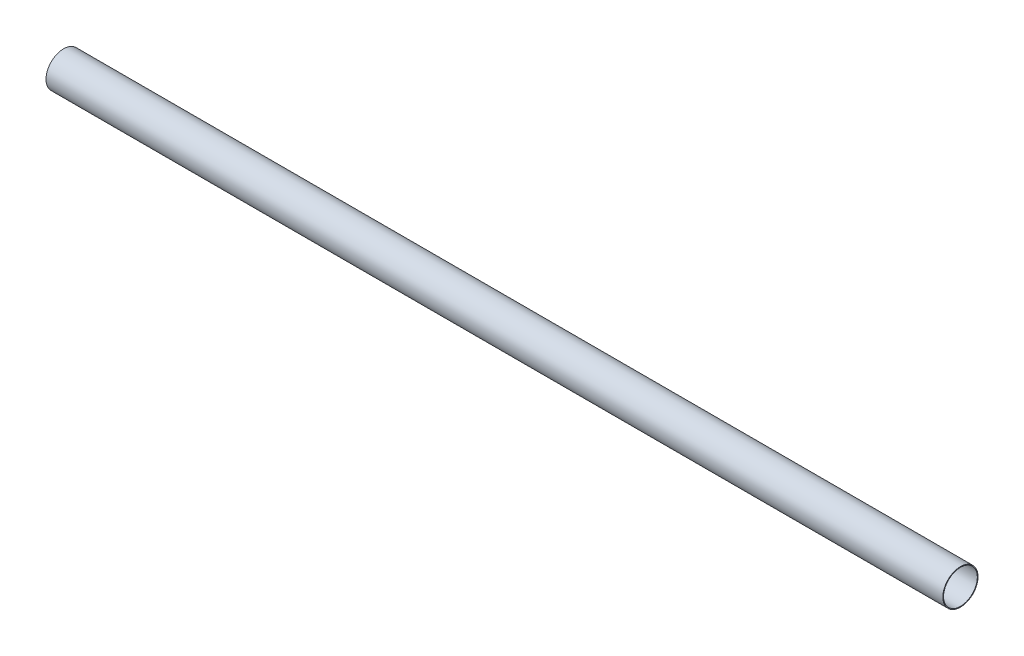
ISO-10303-21;
HEADER;
FILE_DESCRIPTION(('STEP AP214'),'2;1');
FILE_NAME('part.step','',(''),(''),'','','');
FILE_SCHEMA(('AUTOMOTIVE_DESIGN { 1 0 10303 214 1 1 1 1 }'));
ENDSEC;
DATA;
#1=APPLICATION_CONTEXT('core data for automotive mechanical design processes');
#2=APPLICATION_PROTOCOL_DEFINITION('international standard','automotive_design',2000,#1);
#3=PRODUCT_CONTEXT('',#1,'mechanical');
#4=PRODUCT('Part','Part','',(#3));
#5=PRODUCT_RELATED_PRODUCT_CATEGORY('part','',(#4));
#6=PRODUCT_DEFINITION_FORMATION('','',#4);
#7=PRODUCT_DEFINITION_CONTEXT('part definition',#1,'design');
#8=PRODUCT_DEFINITION('design','',#6,#7);
#9=PRODUCT_DEFINITION_SHAPE('','',#8);
#10=(LENGTH_UNIT() NAMED_UNIT(*) SI_UNIT(.MILLI.,.METRE.));
#11=(NAMED_UNIT(*) PLANE_ANGLE_UNIT() SI_UNIT($,.RADIAN.));
#12=(NAMED_UNIT(*) SI_UNIT($,.STERADIAN.) SOLID_ANGLE_UNIT());
#13=UNCERTAINTY_MEASURE_WITH_UNIT(LENGTH_MEASURE(1.E-05),#10,'distance_accuracy_value','');
#14=(GEOMETRIC_REPRESENTATION_CONTEXT(3) GLOBAL_UNCERTAINTY_ASSIGNED_CONTEXT((#13)) GLOBAL_UNIT_ASSIGNED_CONTEXT((#10,
#11,#12)) REPRESENTATION_CONTEXT('',''));
#15=CARTESIAN_POINT('',(0.,0.,0.));
#16=DIRECTION('',(0.,0.,1.));
#17=DIRECTION('',(1.,0.,0.));
#18=AXIS2_PLACEMENT_3D('',#15,#16,#17);
#19=CARTESIAN_POINT('',(500.,15.7,0.));
#20=DIRECTION('',(1.,0.,0.));
#21=DIRECTION('',(0.,0.,-1.));
#22=AXIS2_PLACEMENT_3D('',#19,#20,#21);
#23=PLANE('',#22);
#24=CARTESIAN_POINT('',(500.,0.,0.));
#25=DIRECTION('',(-1.,0.,0.));
#26=DIRECTION('',(0.,0.,1.));
#27=AXIS2_PLACEMENT_3D('',#24,#25,#26);
#28=CIRCLE('',#27,15.05);
#29=CARTESIAN_POINT('',(500.,0.,15.05));
#30=VERTEX_POINT('',#29);
#31=EDGE_CURVE('E10',#30,#30,#28,.T.);
#32=ORIENTED_EDGE('',*,*,#31,.F.);
#33=EDGE_LOOP('',(#32));
#34=FACE_BOUND('',#33,.T.);
#35=CARTESIAN_POINT('',(500.,0.,0.));
#36=DIRECTION('',(-1.,0.,0.));
#37=DIRECTION('',(0.,0.,1.));
#38=AXIS2_PLACEMENT_3D('',#35,#36,#37);
#39=CIRCLE('',#38,15.7);
#40=CARTESIAN_POINT('',(500.,0.,15.7));
#41=VERTEX_POINT('',#40);
#42=EDGE_CURVE('E52',#41,#41,#39,.T.);
#43=ORIENTED_EDGE('',*,*,#42,.T.);
#44=EDGE_LOOP('',(#43));
#45=FACE_BOUND('',#44,.T.);
#46=ADVANCED_FACE('F39',(#34,#45),#23,.F.);
#47=CARTESIAN_POINT('',(-3000.,0.,0.));
#48=DIRECTION('',(-1.,0.,0.));
#49=DIRECTION('',(0.,0.,1.));
#50=AXIS2_PLACEMENT_3D('',#47,#48,#49);
#51=CYLINDRICAL_SURFACE('',#50,15.05);
#52=CARTESIAN_POINT('',(1300.,0.,0.));
#53=DIRECTION('',(-1.,0.,0.));
#54=DIRECTION('',(0.,0.,1.));
#55=AXIS2_PLACEMENT_3D('',#52,#53,#54);
#56=CIRCLE('',#55,15.05);
#57=CARTESIAN_POINT('',(1300.,0.,15.05));
#58=VERTEX_POINT('',#57);
#59=EDGE_CURVE('E44',#58,#58,#56,.T.);
#60=ORIENTED_EDGE('',*,*,#59,.F.);
#61=EDGE_LOOP('',(#60));
#62=FACE_BOUND('',#61,.T.);
#63=ORIENTED_EDGE('',*,*,#31,.T.);
#64=EDGE_LOOP('',(#63));
#65=FACE_BOUND('',#64,.T.);
#66=ADVANCED_FACE('F67',(#62,#65),#51,.F.);
#67=CARTESIAN_POINT('',(1300.,15.05,0.));
#68=DIRECTION('',(-1.,0.,0.));
#69=DIRECTION('',(0.,0.,1.));
#70=AXIS2_PLACEMENT_3D('',#67,#68,#69);
#71=PLANE('',#70);
#72=CARTESIAN_POINT('',(1300.,0.,0.));
#73=DIRECTION('',(-1.,0.,0.));
#74=DIRECTION('',(0.,0.,1.));
#75=AXIS2_PLACEMENT_3D('',#72,#73,#74);
#76=CIRCLE('',#75,15.7);
#77=CARTESIAN_POINT('',(1300.,0.,15.7));
#78=VERTEX_POINT('',#77);
#79=EDGE_CURVE('E47',#78,#78,#76,.T.);
#80=ORIENTED_EDGE('',*,*,#79,.F.);
#81=EDGE_LOOP('',(#80));
#82=FACE_BOUND('',#81,.T.);
#83=ORIENTED_EDGE('',*,*,#59,.T.);
#84=EDGE_LOOP('',(#83));
#85=FACE_BOUND('',#84,.T.);
#86=ADVANCED_FACE('F64',(#82,#85),#71,.F.);
#87=CARTESIAN_POINT('',(-3000.,0.,0.));
#88=DIRECTION('',(-1.,0.,0.));
#89=DIRECTION('',(0.,0.,1.));
#90=AXIS2_PLACEMENT_3D('',#87,#88,#89);
#91=CYLINDRICAL_SURFACE('',#90,15.7);
#92=ORIENTED_EDGE('',*,*,#42,.F.);
#93=EDGE_LOOP('',(#92));
#94=FACE_BOUND('',#93,.T.);
#95=ORIENTED_EDGE('',*,*,#79,.T.);
#96=EDGE_LOOP('',(#95));
#97=FACE_BOUND('',#96,.T.);
#98=ADVANCED_FACE('F58',(#94,#97),#91,.T.);
#99=CLOSED_SHELL('',(#46,#66,#86,#98));
#100=MANIFOLD_SOLID_BREP('B2',#99);
#101=ADVANCED_BREP_SHAPE_REPRESENTATION('',(#18,#100),#14);
#102=SHAPE_DEFINITION_REPRESENTATION(#9,#101);
ENDSEC;
END-ISO-10303-21;
